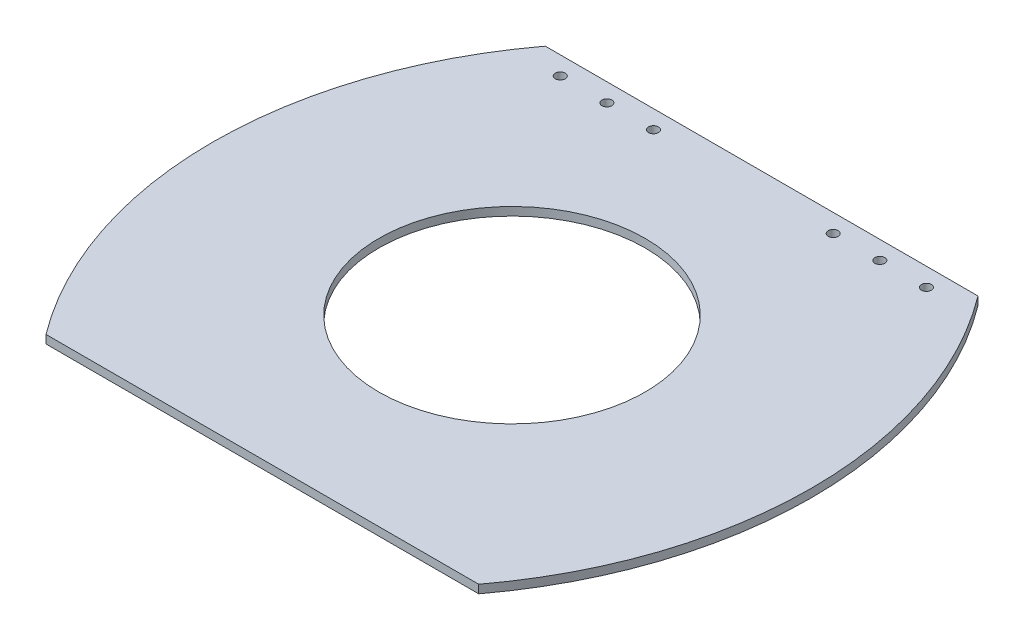
ISO-10303-21;
HEADER;
FILE_DESCRIPTION(('STEP AP214'),'2;1');
FILE_NAME('part.step','',(''),(''),'','','');
FILE_SCHEMA(('AUTOMOTIVE_DESIGN { 1 0 10303 214 1 1 1 1 }'));
ENDSEC;
DATA;
#1=APPLICATION_CONTEXT('core data for automotive mechanical design processes');
#2=APPLICATION_PROTOCOL_DEFINITION('international standard','automotive_design',2000,#1);
#3=PRODUCT_CONTEXT('',#1,'mechanical');
#4=PRODUCT('Part','Part','',(#3));
#5=PRODUCT_RELATED_PRODUCT_CATEGORY('part','',(#4));
#6=PRODUCT_DEFINITION_FORMATION('','',#4);
#7=PRODUCT_DEFINITION_CONTEXT('part definition',#1,'design');
#8=PRODUCT_DEFINITION('design','',#6,#7);
#9=PRODUCT_DEFINITION_SHAPE('','',#8);
#10=(LENGTH_UNIT() NAMED_UNIT(*) SI_UNIT(.MILLI.,.METRE.));
#11=(NAMED_UNIT(*) PLANE_ANGLE_UNIT() SI_UNIT($,.RADIAN.));
#12=(NAMED_UNIT(*) SI_UNIT($,.STERADIAN.) SOLID_ANGLE_UNIT());
#13=UNCERTAINTY_MEASURE_WITH_UNIT(LENGTH_MEASURE(1.E-05),#10,'distance_accuracy_value','');
#14=(GEOMETRIC_REPRESENTATION_CONTEXT(3) GLOBAL_UNCERTAINTY_ASSIGNED_CONTEXT((#13)) GLOBAL_UNIT_ASSIGNED_CONTEXT((#10,
#11,#12)) REPRESENTATION_CONTEXT('',''));
#15=CARTESIAN_POINT('',(0.,0.,0.));
#16=DIRECTION('',(0.,0.,1.));
#17=DIRECTION('',(1.,0.,0.));
#18=AXIS2_PLACEMENT_3D('',#15,#16,#17);
#19=CARTESIAN_POINT('',(70.,5.,0.));
#20=DIRECTION('',(0.,-1.,0.));
#21=DIRECTION('',(0.,0.,-1.));
#22=AXIS2_PLACEMENT_3D('',#19,#20,#21);
#23=CYLINDRICAL_SURFACE('',#22,250.);
#24=CARTESIAN_POINT('',(70.,0.,0.));
#25=DIRECTION('',(0.,1.,0.));
#26=DIRECTION('',(0.,0.,1.));
#27=AXIS2_PLACEMENT_3D('',#24,#25,#26);
#28=CIRCLE('',#27,250.);
#29=CARTESIAN_POINT('',(-130.,0.,-150.));
#30=VERTEX_POINT('',#29);
#31=CARTESIAN_POINT('',(-130.,0.,150.));
#32=VERTEX_POINT('',#31);
#33=EDGE_CURVE('E108',#30,#32,#28,.T.);
#34=ORIENTED_EDGE('',*,*,#33,.T.);
#35=DIRECTION('',(0.,-1.,0.));
#36=VECTOR('',#35,1.);
#37=CARTESIAN_POINT('',(-130.,5.,150.));
#38=LINE('',#37,#36);
#39=CARTESIAN_POINT('',(-130.,5.,150.));
#40=VERTEX_POINT('',#39);
#41=EDGE_CURVE('E11',#40,#32,#38,.T.);
#42=ORIENTED_EDGE('',*,*,#41,.F.);
#43=CARTESIAN_POINT('',(70.,5.,0.));
#44=DIRECTION('',(0.,1.,0.));
#45=DIRECTION('',(0.,0.,1.));
#46=AXIS2_PLACEMENT_3D('',#43,#44,#45);
#47=CIRCLE('',#46,250.);
#48=CARTESIAN_POINT('',(-130.,5.,-150.));
#49=VERTEX_POINT('',#48);
#50=EDGE_CURVE('E96',#49,#40,#47,.T.);
#51=ORIENTED_EDGE('',*,*,#50,.F.);
#52=DIRECTION('',(0.,-1.,0.));
#53=VECTOR('',#52,1.);
#54=CARTESIAN_POINT('',(-130.,5.,-150.));
#55=LINE('',#54,#53);
#56=EDGE_CURVE('E104',#49,#30,#55,.T.);
#57=ORIENTED_EDGE('',*,*,#56,.T.);
#58=EDGE_LOOP('',(#34,#42,#51,#57));
#59=FACE_BOUND('',#58,.T.);
#60=ADVANCED_FACE('F45',(#59),#23,.T.);
#61=CARTESIAN_POINT('',(-130.,5.,150.));
#62=DIRECTION('',(0.,0.,-1.));
#63=DIRECTION('',(-1.,0.,0.));
#64=AXIS2_PLACEMENT_3D('',#61,#62,#63);
#65=PLANE('',#64);
#66=DIRECTION('',(1.,0.,0.));
#67=VECTOR('',#66,1.);
#68=CARTESIAN_POINT('',(-130.,0.,150.));
#69=LINE('',#68,#67);
#70=CARTESIAN_POINT('',(130.,0.,150.));
#71=VERTEX_POINT('',#70);
#72=EDGE_CURVE('E100',#32,#71,#69,.T.);
#73=ORIENTED_EDGE('',*,*,#72,.T.);
#74=DIRECTION('',(0.,-1.,0.));
#75=VECTOR('',#74,1.);
#76=CARTESIAN_POINT('',(130.,5.,150.));
#77=LINE('',#76,#75);
#78=CARTESIAN_POINT('',(130.,5.,150.));
#79=VERTEX_POINT('',#78);
#80=EDGE_CURVE('E53',#79,#71,#77,.T.);
#81=ORIENTED_EDGE('',*,*,#80,.F.);
#82=DIRECTION('',(1.,0.,0.));
#83=VECTOR('',#82,1.);
#84=CARTESIAN_POINT('',(-130.,5.,150.));
#85=LINE('',#84,#83);
#86=EDGE_CURVE('E91',#40,#79,#85,.T.);
#87=ORIENTED_EDGE('',*,*,#86,.F.);
#88=ORIENTED_EDGE('',*,*,#41,.T.);
#89=EDGE_LOOP('',(#73,#81,#87,#88));
#90=FACE_BOUND('',#89,.T.);
#91=ADVANCED_FACE('F99',(#90),#65,.F.);
#92=CARTESIAN_POINT('',(-70.,5.,0.));
#93=DIRECTION('',(0.,-1.,0.));
#94=DIRECTION('',(0.,0.,-1.));
#95=AXIS2_PLACEMENT_3D('',#92,#93,#94);
#96=CYLINDRICAL_SURFACE('',#95,250.);
#97=CARTESIAN_POINT('',(-70.,0.,0.));
#98=DIRECTION('',(0.,1.,0.));
#99=DIRECTION('',(0.,0.,-1.));
#100=AXIS2_PLACEMENT_3D('',#97,#98,#99);
#101=CIRCLE('',#100,250.);
#102=CARTESIAN_POINT('',(130.,0.,-150.));
#103=VERTEX_POINT('',#102);
#104=EDGE_CURVE('E78',#71,#103,#101,.T.);
#105=ORIENTED_EDGE('',*,*,#104,.T.);
#106=DIRECTION('',(0.,-1.,0.));
#107=VECTOR('',#106,1.);
#108=CARTESIAN_POINT('',(130.,5.,-150.));
#109=LINE('',#108,#107);
#110=CARTESIAN_POINT('',(130.,5.,-150.));
#111=VERTEX_POINT('',#110);
#112=EDGE_CURVE('E101',#111,#103,#109,.T.);
#113=ORIENTED_EDGE('',*,*,#112,.F.);
#114=CARTESIAN_POINT('',(-70.,5.,0.));
#115=DIRECTION('',(0.,1.,0.));
#116=DIRECTION('',(0.,0.,-1.));
#117=AXIS2_PLACEMENT_3D('',#114,#115,#116);
#118=CIRCLE('',#117,250.);
#119=EDGE_CURVE('E94',#79,#111,#118,.T.);
#120=ORIENTED_EDGE('',*,*,#119,.F.);
#121=ORIENTED_EDGE('',*,*,#80,.T.);
#122=EDGE_LOOP('',(#105,#113,#120,#121));
#123=FACE_BOUND('',#122,.T.);
#124=ADVANCED_FACE('F102',(#123),#96,.T.);
#125=CARTESIAN_POINT('',(-130.,5.,-150.));
#126=DIRECTION('',(0.,0.,1.));
#127=DIRECTION('',(1.,0.,0.));
#128=AXIS2_PLACEMENT_3D('',#125,#126,#127);
#129=PLANE('',#128);
#130=DIRECTION('',(-1.,0.,0.));
#131=VECTOR('',#130,1.);
#132=CARTESIAN_POINT('',(-130.,0.,-150.));
#133=LINE('',#132,#131);
#134=EDGE_CURVE('E84',#103,#30,#133,.T.);
#135=ORIENTED_EDGE('',*,*,#134,.T.);
#136=ORIENTED_EDGE('',*,*,#56,.F.);
#137=DIRECTION('',(-1.,0.,0.));
#138=VECTOR('',#137,1.);
#139=CARTESIAN_POINT('',(-130.,5.,-150.));
#140=LINE('',#139,#138);
#141=EDGE_CURVE('E61',#111,#49,#140,.T.);
#142=ORIENTED_EDGE('',*,*,#141,.F.);
#143=ORIENTED_EDGE('',*,*,#112,.T.);
#144=EDGE_LOOP('',(#135,#136,#142,#143));
#145=FACE_BOUND('',#144,.T.);
#146=ADVANCED_FACE('F116',(#145),#129,.F.);
#147=CARTESIAN_POINT('',(70.,5.,0.));
#148=DIRECTION('',(0.,1.,0.));
#149=DIRECTION('',(0.,0.,1.));
#150=AXIS2_PLACEMENT_3D('',#147,#148,#149);
#151=PLANE('',#150);
#152=CARTESIAN_POINT('',(-110.,5.,-139.));
#153=DIRECTION('',(0.,1.,0.));
#154=DIRECTION('',(0.,0.,1.));
#155=AXIS2_PLACEMENT_3D('',#152,#153,#154);
#156=CIRCLE('',#155,3.00000000000001);
#157=CARTESIAN_POINT('',(-110.,5.,-136.));
#158=VERTEX_POINT('',#157);
#159=EDGE_CURVE('E158',#158,#158,#156,.T.);
#160=ORIENTED_EDGE('',*,*,#159,.F.);
#161=EDGE_LOOP('',(#160));
#162=FACE_BOUND('',#161,.T.);
#163=CARTESIAN_POINT('',(-82.,5.,-139.));
#164=DIRECTION('',(0.,1.,0.));
#165=DIRECTION('',(0.,0.,1.));
#166=AXIS2_PLACEMENT_3D('',#163,#164,#165);
#167=CIRCLE('',#166,3.00000000000001);
#168=CARTESIAN_POINT('',(-82.,5.,-136.));
#169=VERTEX_POINT('',#168);
#170=EDGE_CURVE('E155',#169,#169,#167,.T.);
#171=ORIENTED_EDGE('',*,*,#170,.F.);
#172=EDGE_LOOP('',(#171));
#173=FACE_BOUND('',#172,.T.);
#174=CARTESIAN_POINT('',(-54.,5.,-139.));
#175=DIRECTION('',(0.,1.,0.));
#176=DIRECTION('',(0.,0.,1.));
#177=AXIS2_PLACEMENT_3D('',#174,#175,#176);
#178=CIRCLE('',#177,3.);
#179=CARTESIAN_POINT('',(-54.,5.,-136.));
#180=VERTEX_POINT('',#179);
#181=EDGE_CURVE('E149',#180,#180,#178,.T.);
#182=ORIENTED_EDGE('',*,*,#181,.F.);
#183=EDGE_LOOP('',(#182));
#184=FACE_BOUND('',#183,.T.);
#185=CARTESIAN_POINT('',(54.,5.,-139.));
#186=DIRECTION('',(0.,1.,0.));
#187=DIRECTION('',(0.,0.,1.));
#188=AXIS2_PLACEMENT_3D('',#185,#186,#187);
#189=CIRCLE('',#188,3.00000000000001);
#190=CARTESIAN_POINT('',(54.,5.,-136.));
#191=VERTEX_POINT('',#190);
#192=EDGE_CURVE('E143',#191,#191,#189,.T.);
#193=ORIENTED_EDGE('',*,*,#192,.F.);
#194=EDGE_LOOP('',(#193));
#195=FACE_BOUND('',#194,.T.);
#196=CARTESIAN_POINT('',(82.,5.,-139.));
#197=DIRECTION('',(0.,1.,0.));
#198=DIRECTION('',(0.,0.,1.));
#199=AXIS2_PLACEMENT_3D('',#196,#197,#198);
#200=CIRCLE('',#199,3.00000000000001);
#201=CARTESIAN_POINT('',(82.,5.,-136.));
#202=VERTEX_POINT('',#201);
#203=EDGE_CURVE('E137',#202,#202,#200,.T.);
#204=ORIENTED_EDGE('',*,*,#203,.F.);
#205=EDGE_LOOP('',(#204));
#206=FACE_BOUND('',#205,.T.);
#207=CARTESIAN_POINT('',(110.,5.,-139.));
#208=DIRECTION('',(0.,1.,0.));
#209=DIRECTION('',(0.,0.,1.));
#210=AXIS2_PLACEMENT_3D('',#207,#208,#209);
#211=CIRCLE('',#210,2.99999999999999);
#212=CARTESIAN_POINT('',(110.,5.,-136.));
#213=VERTEX_POINT('',#212);
#214=EDGE_CURVE('E131',#213,#213,#211,.T.);
#215=ORIENTED_EDGE('',*,*,#214,.F.);
#216=EDGE_LOOP('',(#215));
#217=FACE_BOUND('',#216,.T.);
#218=CARTESIAN_POINT('',(0.,5.,0.));
#219=DIRECTION('',(0.,1.,0.));
#220=DIRECTION('',(0.,0.,1.));
#221=AXIS2_PLACEMENT_3D('',#218,#219,#220);
#222=CIRCLE('',#221,80.);
#223=CARTESIAN_POINT('',(0.,5.,80.));
#224=VERTEX_POINT('',#223);
#225=EDGE_CURVE('E111',#224,#224,#222,.T.);
#226=ORIENTED_EDGE('',*,*,#225,.F.);
#227=EDGE_LOOP('',(#226));
#228=FACE_BOUND('',#227,.T.);
#229=ORIENTED_EDGE('',*,*,#50,.T.);
#230=ORIENTED_EDGE('',*,*,#86,.T.);
#231=ORIENTED_EDGE('',*,*,#119,.T.);
#232=ORIENTED_EDGE('',*,*,#141,.T.);
#233=EDGE_LOOP('',(#229,#230,#231,#232));
#234=FACE_BOUND('',#233,.T.);
#235=ADVANCED_FACE('F92',(#162,#173,#184,#195,#206,#217,#228,#234),#151,.T.);
#236=CARTESIAN_POINT('',(70.,0.,0.));
#237=DIRECTION('',(0.,1.,0.));
#238=DIRECTION('',(0.,0.,1.));
#239=AXIS2_PLACEMENT_3D('',#236,#237,#238);
#240=PLANE('',#239);
#241=CARTESIAN_POINT('',(-110.,0.,-139.));
#242=DIRECTION('',(0.,1.,0.));
#243=DIRECTION('',(0.,0.,1.));
#244=AXIS2_PLACEMENT_3D('',#241,#242,#243);
#245=CIRCLE('',#244,3.00000000000001);
#246=CARTESIAN_POINT('',(-110.,0.,-136.));
#247=VERTEX_POINT('',#246);
#248=EDGE_CURVE('E127',#247,#247,#245,.T.);
#249=ORIENTED_EDGE('',*,*,#248,.T.);
#250=EDGE_LOOP('',(#249));
#251=FACE_BOUND('',#250,.T.);
#252=CARTESIAN_POINT('',(-82.,0.,-139.));
#253=DIRECTION('',(0.,1.,0.));
#254=DIRECTION('',(0.,0.,1.));
#255=AXIS2_PLACEMENT_3D('',#252,#253,#254);
#256=CIRCLE('',#255,3.00000000000001);
#257=CARTESIAN_POINT('',(-82.,0.,-136.));
#258=VERTEX_POINT('',#257);
#259=EDGE_CURVE('E152',#258,#258,#256,.T.);
#260=ORIENTED_EDGE('',*,*,#259,.T.);
#261=EDGE_LOOP('',(#260));
#262=FACE_BOUND('',#261,.T.);
#263=CARTESIAN_POINT('',(-54.,0.,-139.));
#264=DIRECTION('',(0.,1.,0.));
#265=DIRECTION('',(0.,0.,1.));
#266=AXIS2_PLACEMENT_3D('',#263,#264,#265);
#267=CIRCLE('',#266,3.);
#268=CARTESIAN_POINT('',(-54.,0.,-136.));
#269=VERTEX_POINT('',#268);
#270=EDGE_CURVE('E146',#269,#269,#267,.T.);
#271=ORIENTED_EDGE('',*,*,#270,.T.);
#272=EDGE_LOOP('',(#271));
#273=FACE_BOUND('',#272,.T.);
#274=CARTESIAN_POINT('',(54.,0.,-139.));
#275=DIRECTION('',(0.,1.,0.));
#276=DIRECTION('',(0.,0.,1.));
#277=AXIS2_PLACEMENT_3D('',#274,#275,#276);
#278=CIRCLE('',#277,3.00000000000001);
#279=CARTESIAN_POINT('',(54.,0.,-136.));
#280=VERTEX_POINT('',#279);
#281=EDGE_CURVE('E140',#280,#280,#278,.T.);
#282=ORIENTED_EDGE('',*,*,#281,.T.);
#283=EDGE_LOOP('',(#282));
#284=FACE_BOUND('',#283,.T.);
#285=CARTESIAN_POINT('',(82.,0.,-139.));
#286=DIRECTION('',(0.,1.,0.));
#287=DIRECTION('',(0.,0.,1.));
#288=AXIS2_PLACEMENT_3D('',#285,#286,#287);
#289=CIRCLE('',#288,3.00000000000001);
#290=CARTESIAN_POINT('',(82.,0.,-136.));
#291=VERTEX_POINT('',#290);
#292=EDGE_CURVE('E134',#291,#291,#289,.T.);
#293=ORIENTED_EDGE('',*,*,#292,.T.);
#294=EDGE_LOOP('',(#293));
#295=FACE_BOUND('',#294,.T.);
#296=CARTESIAN_POINT('',(110.,0.,-139.));
#297=DIRECTION('',(0.,1.,0.));
#298=DIRECTION('',(0.,0.,1.));
#299=AXIS2_PLACEMENT_3D('',#296,#297,#298);
#300=CIRCLE('',#299,2.99999999999999);
#301=CARTESIAN_POINT('',(110.,0.,-136.));
#302=VERTEX_POINT('',#301);
#303=EDGE_CURVE('E128',#302,#302,#300,.T.);
#304=ORIENTED_EDGE('',*,*,#303,.T.);
#305=EDGE_LOOP('',(#304));
#306=FACE_BOUND('',#305,.T.);
#307=CARTESIAN_POINT('',(0.,0.,0.));
#308=DIRECTION('',(0.,-1.,0.));
#309=DIRECTION('',(0.,0.,-1.));
#310=AXIS2_PLACEMENT_3D('',#307,#308,#309);
#311=CIRCLE('',#310,80.);
#312=CARTESIAN_POINT('',(0.,0.,-80.));
#313=VERTEX_POINT('',#312);
#314=EDGE_CURVE('E124',#313,#313,#311,.T.);
#315=ORIENTED_EDGE('',*,*,#314,.F.);
#316=EDGE_LOOP('',(#315));
#317=FACE_BOUND('',#316,.T.);
#318=ORIENTED_EDGE('',*,*,#33,.F.);
#319=ORIENTED_EDGE('',*,*,#134,.F.);
#320=ORIENTED_EDGE('',*,*,#104,.F.);
#321=ORIENTED_EDGE('',*,*,#72,.F.);
#322=EDGE_LOOP('',(#318,#319,#320,#321));
#323=FACE_BOUND('',#322,.T.);
#324=ADVANCED_FACE('F119',(#251,#262,#273,#284,#295,#306,#317,#323),#240,.F.);
#325=CARTESIAN_POINT('',(0.,10.,0.));
#326=DIRECTION('',(0.,-1.,0.));
#327=DIRECTION('',(0.,0.,-1.));
#328=AXIS2_PLACEMENT_3D('',#325,#326,#327);
#329=CYLINDRICAL_SURFACE('',#328,80.);
#330=ORIENTED_EDGE('',*,*,#225,.T.);
#331=EDGE_LOOP('',(#330));
#332=FACE_BOUND('',#331,.T.);
#333=ORIENTED_EDGE('',*,*,#314,.T.);
#334=EDGE_LOOP('',(#333));
#335=FACE_BOUND('',#334,.T.);
#336=ADVANCED_FACE('F188',(#332,#335),#329,.F.);
#337=CARTESIAN_POINT('',(110.,0.,-139.));
#338=DIRECTION('',(0.,1.,0.));
#339=DIRECTION('',(0.,0.,1.));
#340=AXIS2_PLACEMENT_3D('',#337,#338,#339);
#341=CYLINDRICAL_SURFACE('',#340,2.99999999999999);
#342=ORIENTED_EDGE('',*,*,#303,.F.);
#343=EDGE_LOOP('',(#342));
#344=FACE_BOUND('',#343,.T.);
#345=ORIENTED_EDGE('',*,*,#214,.T.);
#346=EDGE_LOOP('',(#345));
#347=FACE_BOUND('',#346,.T.);
#348=ADVANCED_FACE('F191',(#344,#347),#341,.F.);
#349=CARTESIAN_POINT('',(82.,0.,-139.));
#350=DIRECTION('',(0.,1.,0.));
#351=DIRECTION('',(0.,0.,1.));
#352=AXIS2_PLACEMENT_3D('',#349,#350,#351);
#353=CYLINDRICAL_SURFACE('',#352,3.00000000000001);
#354=ORIENTED_EDGE('',*,*,#292,.F.);
#355=EDGE_LOOP('',(#354));
#356=FACE_BOUND('',#355,.T.);
#357=ORIENTED_EDGE('',*,*,#203,.T.);
#358=EDGE_LOOP('',(#357));
#359=FACE_BOUND('',#358,.T.);
#360=ADVANCED_FACE('F231',(#356,#359),#353,.F.);
#361=CARTESIAN_POINT('',(54.,0.,-139.));
#362=DIRECTION('',(0.,1.,0.));
#363=DIRECTION('',(0.,0.,1.));
#364=AXIS2_PLACEMENT_3D('',#361,#362,#363);
#365=CYLINDRICAL_SURFACE('',#364,3.00000000000001);
#366=ORIENTED_EDGE('',*,*,#281,.F.);
#367=EDGE_LOOP('',(#366));
#368=FACE_BOUND('',#367,.T.);
#369=ORIENTED_EDGE('',*,*,#192,.T.);
#370=EDGE_LOOP('',(#369));
#371=FACE_BOUND('',#370,.T.);
#372=ADVANCED_FACE('F240',(#368,#371),#365,.F.);
#373=CARTESIAN_POINT('',(-54.,0.,-139.));
#374=DIRECTION('',(0.,1.,0.));
#375=DIRECTION('',(0.,0.,1.));
#376=AXIS2_PLACEMENT_3D('',#373,#374,#375);
#377=CYLINDRICAL_SURFACE('',#376,3.);
#378=ORIENTED_EDGE('',*,*,#270,.F.);
#379=EDGE_LOOP('',(#378));
#380=FACE_BOUND('',#379,.T.);
#381=ORIENTED_EDGE('',*,*,#181,.T.);
#382=EDGE_LOOP('',(#381));
#383=FACE_BOUND('',#382,.T.);
#384=ADVANCED_FACE('F249',(#380,#383),#377,.F.);
#385=CARTESIAN_POINT('',(-82.,0.,-139.));
#386=DIRECTION('',(0.,1.,0.));
#387=DIRECTION('',(0.,0.,1.));
#388=AXIS2_PLACEMENT_3D('',#385,#386,#387);
#389=CYLINDRICAL_SURFACE('',#388,3.00000000000001);
#390=ORIENTED_EDGE('',*,*,#259,.F.);
#391=EDGE_LOOP('',(#390));
#392=FACE_BOUND('',#391,.T.);
#393=ORIENTED_EDGE('',*,*,#170,.T.);
#394=EDGE_LOOP('',(#393));
#395=FACE_BOUND('',#394,.T.);
#396=ADVANCED_FACE('F169',(#392,#395),#389,.F.);
#397=CARTESIAN_POINT('',(-110.,0.,-139.));
#398=DIRECTION('',(0.,1.,0.));
#399=DIRECTION('',(0.,0.,1.));
#400=AXIS2_PLACEMENT_3D('',#397,#398,#399);
#401=CYLINDRICAL_SURFACE('',#400,3.00000000000001);
#402=ORIENTED_EDGE('',*,*,#248,.F.);
#403=EDGE_LOOP('',(#402));
#404=FACE_BOUND('',#403,.T.);
#405=ORIENTED_EDGE('',*,*,#159,.T.);
#406=EDGE_LOOP('',(#405));
#407=FACE_BOUND('',#406,.T.);
#408=ADVANCED_FACE('F166',(#404,#407),#401,.F.);
#409=CLOSED_SHELL('',(#60,#91,#124,#146,#235,#324,#336,#348,#360,#372,#384,#396,#408));
#410=MANIFOLD_SOLID_BREP('B2',#409);
#411=ADVANCED_BREP_SHAPE_REPRESENTATION('',(#18,#410),#14);
#412=SHAPE_DEFINITION_REPRESENTATION(#9,#411);
ENDSEC;
END-ISO-10303-21;
